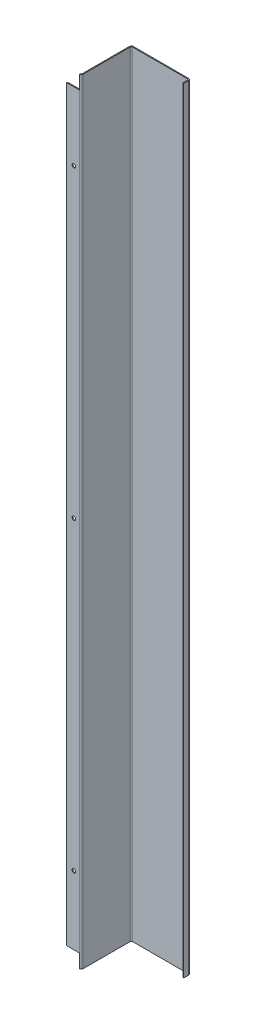
ISO-10303-21;
HEADER;
FILE_DESCRIPTION(('STEP AP214'),'2;1');
FILE_NAME('part.step','',(''),(''),'','','');
FILE_SCHEMA(('AUTOMOTIVE_DESIGN { 1 0 10303 214 1 1 1 1 }'));
ENDSEC;
DATA;
#1=APPLICATION_CONTEXT('core data for automotive mechanical design processes');
#2=APPLICATION_PROTOCOL_DEFINITION('international standard','automotive_design',2000,#1);
#3=PRODUCT_CONTEXT('',#1,'mechanical');
#4=PRODUCT('Part','Part','',(#3));
#5=PRODUCT_RELATED_PRODUCT_CATEGORY('part','',(#4));
#6=PRODUCT_DEFINITION_FORMATION('','',#4);
#7=PRODUCT_DEFINITION_CONTEXT('part definition',#1,'design');
#8=PRODUCT_DEFINITION('design','',#6,#7);
#9=PRODUCT_DEFINITION_SHAPE('','',#8);
#10=(LENGTH_UNIT() NAMED_UNIT(*) SI_UNIT(.MILLI.,.METRE.));
#11=(NAMED_UNIT(*) PLANE_ANGLE_UNIT() SI_UNIT($,.RADIAN.));
#12=(NAMED_UNIT(*) SI_UNIT($,.STERADIAN.) SOLID_ANGLE_UNIT());
#13=UNCERTAINTY_MEASURE_WITH_UNIT(LENGTH_MEASURE(1.E-05),#10,'distance_accuracy_value','');
#14=(GEOMETRIC_REPRESENTATION_CONTEXT(3) GLOBAL_UNCERTAINTY_ASSIGNED_CONTEXT((#13)) GLOBAL_UNIT_ASSIGNED_CONTEXT((#10,
#11,#12)) REPRESENTATION_CONTEXT('',''));
#15=CARTESIAN_POINT('',(0.,0.,0.));
#16=DIRECTION('',(0.,0.,1.));
#17=DIRECTION('',(1.,0.,0.));
#18=AXIS2_PLACEMENT_3D('',#15,#16,#17);
#19=CARTESIAN_POINT('',(-28.3908045977013,-1406.37931034483,108.));
#20=DIRECTION('',(0.,1.,0.));
#21=DIRECTION('',(-1.,0.,0.));
#22=AXIS2_PLACEMENT_3D('',#19,#20,#21);
#23=PLANE('',#22);
#24=DIRECTION('',(1.,0.,0.));
#25=VECTOR('',#24,1.);
#26=CARTESIAN_POINT('',(-28.3908045977014,-1406.37931034483,106.));
#27=LINE('',#26,#25);
#28=CARTESIAN_POINT('',(-28.3908045977014,-1406.37931034483,106.));
#29=VERTEX_POINT('',#28);
#30=CARTESIAN_POINT('',(-26.3908045977013,-1406.37931034483,106.));
#31=VERTEX_POINT('',#30);
#32=EDGE_CURVE('E263',#29,#31,#27,.T.);
#33=ORIENTED_EDGE('',*,*,#32,.F.);
#34=DIRECTION('',(0.,0.,1.));
#35=VECTOR('',#34,1.);
#36=CARTESIAN_POINT('',(-28.3908045977009,-1406.37931034483,-1.0548335315269E-13));
#37=LINE('',#36,#35);
#38=CARTESIAN_POINT('',(-28.3908045977009,-1406.37931034483,2.5000000000001));
#39=VERTEX_POINT('',#38);
#40=EDGE_CURVE('E272',#39,#29,#37,.T.);
#41=ORIENTED_EDGE('',*,*,#40,.F.);
#42=DIRECTION('',(1.,0.,0.));
#43=VECTOR('',#42,1.);
#44=CARTESIAN_POINT('',(-26.3908045977009,-1406.37931034483,2.5000000000001));
#45=LINE('',#44,#43);
#46=CARTESIAN_POINT('',(-26.3908045977011,-1406.37931034483,2.50000000000012));
#47=VERTEX_POINT('',#46);
#48=EDGE_CURVE('E283',#47,#39,#45,.F.);
#49=ORIENTED_EDGE('',*,*,#48,.F.);
#50=DIRECTION('',(0.,0.,-1.));
#51=VECTOR('',#50,1.);
#52=CARTESIAN_POINT('',(-26.3908045977013,-1406.37931034483,108.));
#53=LINE('',#52,#51);
#54=EDGE_CURVE('E277',#47,#31,#53,.F.);
#55=ORIENTED_EDGE('',*,*,#54,.T.);
#56=EDGE_LOOP('',(#33,#41,#49,#55));
#57=FACE_BOUND('',#56,.T.);
#58=ADVANCED_FACE('F78',(#57),#23,.F.);
#59=CARTESIAN_POINT('',(-28.3908045977011,293.620689655173,0.));
#60=DIRECTION('',(0.,-1.,0.));
#61=DIRECTION('',(1.,0.,0.));
#62=AXIS2_PLACEMENT_3D('',#59,#60,#61);
#63=PLANE('',#62);
#64=DIRECTION('',(1.,0.,0.));
#65=VECTOR('',#64,1.);
#66=CARTESIAN_POINT('',(-28.3908045977014,293.620689655173,106.));
#67=LINE('',#66,#65);
#68=CARTESIAN_POINT('',(-28.3908045977014,293.620689655173,106.));
#69=VERTEX_POINT('',#68);
#70=CARTESIAN_POINT('',(-26.3908045977014,293.620689655173,106.));
#71=VERTEX_POINT('',#70);
#72=EDGE_CURVE('E255',#69,#71,#67,.T.);
#73=ORIENTED_EDGE('',*,*,#72,.T.);
#74=DIRECTION('',(0.,0.,1.));
#75=VECTOR('',#74,1.);
#76=CARTESIAN_POINT('',(-26.3908045977011,293.620689655173,0.));
#77=LINE('',#76,#75);
#78=CARTESIAN_POINT('',(-26.3908045977011,293.620689655173,2.49999999999997));
#79=VERTEX_POINT('',#78);
#80=EDGE_CURVE('E275',#71,#79,#77,.F.);
#81=ORIENTED_EDGE('',*,*,#80,.T.);
#82=DIRECTION('',(1.,0.,0.));
#83=VECTOR('',#82,1.);
#84=CARTESIAN_POINT('',(-28.3908045977011,293.620689655173,2.49999999999998));
#85=LINE('',#84,#83);
#86=CARTESIAN_POINT('',(-28.3908045977011,293.620689655173,2.49999999999997));
#87=VERTEX_POINT('',#86);
#88=EDGE_CURVE('E266',#79,#87,#85,.F.);
#89=ORIENTED_EDGE('',*,*,#88,.T.);
#90=DIRECTION('',(0.,0.,-1.));
#91=VECTOR('',#90,1.);
#92=CARTESIAN_POINT('',(-28.3908045977011,293.620689655173,-1.05483353152691E-13));
#93=LINE('',#92,#91);
#94=EDGE_CURVE('E269',#69,#87,#93,.T.);
#95=ORIENTED_EDGE('',*,*,#94,.F.);
#96=EDGE_LOOP('',(#73,#81,#89,#95));
#97=FACE_BOUND('',#96,.T.);
#98=ADVANCED_FACE('F438',(#97),#63,.F.);
#99=CARTESIAN_POINT('',(-28.3908045977011,0.,-1.05483353152691E-13));
#100=DIRECTION('',(1.,0.,0.));
#101=DIRECTION('',(0.,0.,-1.));
#102=AXIS2_PLACEMENT_3D('',#99,#100,#101);
#103=PLANE('',#102);
#104=DIRECTION('',(0.,1.,0.));
#105=VECTOR('',#104,1.);
#106=CARTESIAN_POINT('',(-28.3908045977014,293.620689655173,106.));
#107=LINE('',#106,#105);
#108=EDGE_CURVE('E260',#69,#29,#107,.F.);
#109=ORIENTED_EDGE('',*,*,#108,.F.);
#110=ORIENTED_EDGE('',*,*,#94,.T.);
#111=DIRECTION('',(0.,-1.,0.));
#112=VECTOR('',#111,1.);
#113=CARTESIAN_POINT('',(-28.3908045977011,293.620689655173,2.49999999999998));
#114=LINE('',#113,#112);
#115=EDGE_CURVE('E280',#39,#87,#114,.F.);
#116=ORIENTED_EDGE('',*,*,#115,.F.);
#117=ORIENTED_EDGE('',*,*,#40,.T.);
#118=EDGE_LOOP('',(#109,#110,#116,#117));
#119=FACE_BOUND('',#118,.T.);
#120=ADVANCED_FACE('F428',(#119),#103,.F.);
#121=CARTESIAN_POINT('',(-26.3908045977011,0.,0.));
#122=DIRECTION('',(1.,0.,0.));
#123=DIRECTION('',(0.,0.,-1.));
#124=AXIS2_PLACEMENT_3D('',#121,#122,#123);
#125=PLANE('',#124);
#126=ORIENTED_EDGE('',*,*,#80,.F.);
#127=DIRECTION('',(0.,1.,0.));
#128=VECTOR('',#127,1.);
#129=CARTESIAN_POINT('',(-26.3908045977014,293.620689655173,106.));
#130=LINE('',#129,#128);
#131=EDGE_CURVE('E248',#71,#31,#130,.F.);
#132=ORIENTED_EDGE('',*,*,#131,.T.);
#133=ORIENTED_EDGE('',*,*,#54,.F.);
#134=DIRECTION('',(0.,-1.,0.));
#135=VECTOR('',#134,1.);
#136=CARTESIAN_POINT('',(-26.3908045977011,293.620689655173,2.49999999999999));
#137=LINE('',#136,#135);
#138=EDGE_CURVE('E286',#79,#47,#137,.T.);
#139=ORIENTED_EDGE('',*,*,#138,.F.);
#140=EDGE_LOOP('',(#126,#132,#133,#139));
#141=FACE_BOUND('',#140,.T.);
#142=ADVANCED_FACE('F418',(#141),#125,.T.);
#143=CARTESIAN_POINT('',(0.,0.,-2.));
#144=DIRECTION('',(0.,0.,-1.));
#145=DIRECTION('',(-1.,0.,0.));
#146=AXIS2_PLACEMENT_3D('',#143,#144,#145);
#147=PLANE('',#146);
#148=DIRECTION('',(1.,0.,0.));
#149=VECTOR('',#148,1.);
#150=CARTESIAN_POINT('',(101.609195402299,-1406.37931034483,-2.));
#151=LINE('',#150,#149);
#152=CARTESIAN_POINT('',(-23.8908045977008,-1406.37931034483,-1.99999999999998));
#153=VERTEX_POINT('',#152);
#154=CARTESIAN_POINT('',(97.1091954022989,-1406.37931034483,-2.));
#155=VERTEX_POINT('',#154);
#156=EDGE_CURVE('E370',#153,#155,#151,.T.);
#157=ORIENTED_EDGE('',*,*,#156,.F.);
#158=DIRECTION('',(0.,-1.,0.));
#159=VECTOR('',#158,1.);
#160=CARTESIAN_POINT('',(-23.8908045977008,-1406.37931034483,-1.99999999999998));
#161=LINE('',#160,#159);
#162=CARTESIAN_POINT('',(-23.8908045977009,293.620689655173,-2.));
#163=VERTEX_POINT('',#162);
#164=EDGE_CURVE('E290',#153,#163,#161,.F.);
#165=ORIENTED_EDGE('',*,*,#164,.T.);
#166=DIRECTION('',(-1.,0.,0.));
#167=VECTOR('',#166,1.);
#168=CARTESIAN_POINT('',(101.609195402299,293.620689655173,-2.));
#169=LINE('',#168,#167);
#170=CARTESIAN_POINT('',(97.1091954022988,293.620689655173,-1.99999999999998));
#171=VERTEX_POINT('',#170);
#172=EDGE_CURVE('E367',#171,#163,#169,.T.);
#173=ORIENTED_EDGE('',*,*,#172,.F.);
#174=DIRECTION('',(0.,1.,0.));
#175=VECTOR('',#174,1.);
#176=CARTESIAN_POINT('',(97.1091954022988,293.620689655173,-1.99999999999998));
#177=LINE('',#176,#175);
#178=EDGE_CURVE('E343',#171,#155,#177,.F.);
#179=ORIENTED_EDGE('',*,*,#178,.T.);
#180=EDGE_LOOP('',(#157,#165,#173,#179));
#181=FACE_BOUND('',#180,.T.);
#182=ADVANCED_FACE('F504',(#181),#147,.T.);
#183=CARTESIAN_POINT('',(0.,0.,0.));
#184=DIRECTION('',(0.,0.,-1.));
#185=DIRECTION('',(-1.,0.,0.));
#186=AXIS2_PLACEMENT_3D('',#183,#184,#185);
#187=PLANE('',#186);
#188=DIRECTION('',(0.,-1.,0.));
#189=VECTOR('',#188,1.);
#190=CARTESIAN_POINT('',(-23.8908045977009,-1406.37931034483,0.));
#191=LINE('',#190,#189);
#192=CARTESIAN_POINT('',(-23.8908045977009,-1406.37931034483,0.));
#193=VERTEX_POINT('',#192);
#194=CARTESIAN_POINT('',(-23.8908045977009,293.620689655173,-1.24032728532342E-13));
#195=VERTEX_POINT('',#194);
#196=EDGE_CURVE('E303',#193,#195,#191,.F.);
#197=ORIENTED_EDGE('',*,*,#196,.F.);
#198=DIRECTION('',(1.,0.,0.));
#199=VECTOR('',#198,1.);
#200=CARTESIAN_POINT('',(101.609195402299,-1406.37931034483,0.));
#201=LINE('',#200,#199);
#202=CARTESIAN_POINT('',(97.1091954022989,-1406.37931034483,-1.25333771139324E-13));
#203=VERTEX_POINT('',#202);
#204=EDGE_CURVE('E371',#193,#203,#201,.T.);
#205=ORIENTED_EDGE('',*,*,#204,.T.);
#206=DIRECTION('',(0.,1.,0.));
#207=VECTOR('',#206,1.);
#208=CARTESIAN_POINT('',(97.1091954022989,293.620689655173,0.));
#209=LINE('',#208,#207);
#210=CARTESIAN_POINT('',(97.1091954022989,293.620689655173,0.));
#211=VERTEX_POINT('',#210);
#212=EDGE_CURVE('E356',#211,#203,#209,.F.);
#213=ORIENTED_EDGE('',*,*,#212,.F.);
#214=DIRECTION('',(-1.,0.,0.));
#215=VECTOR('',#214,1.);
#216=CARTESIAN_POINT('',(101.609195402299,293.620689655173,0.));
#217=LINE('',#216,#215);
#218=EDGE_CURVE('E364',#211,#195,#217,.T.);
#219=ORIENTED_EDGE('',*,*,#218,.T.);
#220=EDGE_LOOP('',(#197,#205,#213,#219));
#221=FACE_BOUND('',#220,.T.);
#222=ADVANCED_FACE('F507',(#221),#187,.F.);
#223=CARTESIAN_POINT('',(101.609195402299,-1406.37931034483,-2.));
#224=DIRECTION('',(0.,-1.,0.));
#225=DIRECTION('',(0.,0.,-1.));
#226=AXIS2_PLACEMENT_3D('',#223,#224,#225);
#227=PLANE('',#226);
#228=ORIENTED_EDGE('',*,*,#204,.F.);
#229=DIRECTION('',(0.,0.,-1.));
#230=VECTOR('',#229,1.);
#231=CARTESIAN_POINT('',(-23.8908045977009,-1406.37931034483,0.));
#232=LINE('',#231,#230);
#233=EDGE_CURVE('E297',#193,#153,#232,.T.);
#234=ORIENTED_EDGE('',*,*,#233,.T.);
#235=ORIENTED_EDGE('',*,*,#156,.T.);
#236=DIRECTION('',(0.,0.,-1.));
#237=VECTOR('',#236,1.);
#238=CARTESIAN_POINT('',(97.1091954022989,-1406.37931034483,-1.25333771139324E-13));
#239=LINE('',#238,#237);
#240=EDGE_CURVE('E361',#203,#155,#239,.T.);
#241=ORIENTED_EDGE('',*,*,#240,.F.);
#242=EDGE_LOOP('',(#228,#234,#235,#241));
#243=FACE_BOUND('',#242,.T.);
#244=ADVANCED_FACE('F510',(#243),#227,.T.);
#245=CARTESIAN_POINT('',(101.609195402299,293.620689655173,-2.));
#246=DIRECTION('',(0.,1.,0.));
#247=DIRECTION('',(0.,0.,1.));
#248=AXIS2_PLACEMENT_3D('',#245,#246,#247);
#249=PLANE('',#248);
#250=DIRECTION('',(0.,0.,-1.));
#251=VECTOR('',#250,1.);
#252=CARTESIAN_POINT('',(-23.8908045977009,293.620689655173,-1.24032728532342E-13));
#253=LINE('',#252,#251);
#254=EDGE_CURVE('E307',#195,#163,#253,.T.);
#255=ORIENTED_EDGE('',*,*,#254,.F.);
#256=ORIENTED_EDGE('',*,*,#218,.F.);
#257=DIRECTION('',(0.,0.,-1.));
#258=VECTOR('',#257,1.);
#259=CARTESIAN_POINT('',(97.1091954022989,293.620689655173,0.));
#260=LINE('',#259,#258);
#261=EDGE_CURVE('E350',#211,#171,#260,.T.);
#262=ORIENTED_EDGE('',*,*,#261,.T.);
#263=ORIENTED_EDGE('',*,*,#172,.T.);
#264=EDGE_LOOP('',(#255,#256,#262,#263));
#265=FACE_BOUND('',#264,.T.);
#266=ADVANCED_FACE('F80',(#265),#249,.T.);
#267=CARTESIAN_POINT('',(97.109195402299,-1406.37931034483,2.49999999999997));
#268=DIRECTION('',(0.,-1.,0.));
#269=DIRECTION('',(0.,0.,-1.));
#270=AXIS2_PLACEMENT_3D('',#267,#268,#269);
#271=PLANE('',#270);
#272=DIRECTION('',(-1.,0.,0.));
#273=VECTOR('',#272,1.);
#274=CARTESIAN_POINT('',(101.609195402299,-1406.37931034483,2.49999999999998));
#275=LINE('',#274,#273);
#276=CARTESIAN_POINT('',(99.6091954022991,-1406.37931034483,2.49999999999996));
#277=VERTEX_POINT('',#276);
#278=CARTESIAN_POINT('',(101.609195402299,-1406.37931034483,2.49999999999995));
#279=VERTEX_POINT('',#278);
#280=EDGE_CURVE('E310',#277,#279,#275,.F.);
#281=ORIENTED_EDGE('',*,*,#280,.F.);
#282=CARTESIAN_POINT('',(97.109195402299,-1406.37931034483,2.49999999999997));
#283=DIRECTION('',(0.,1.,0.));
#284=DIRECTION('',(0.,0.,1.));
#285=AXIS2_PLACEMENT_3D('',#282,#283,#284);
#286=CIRCLE('',#285,2.5000000000001);
#287=EDGE_CURVE('E353',#203,#277,#286,.F.);
#288=ORIENTED_EDGE('',*,*,#287,.F.);
#289=ORIENTED_EDGE('',*,*,#240,.T.);
#290=CARTESIAN_POINT('',(97.109195402299,-1406.37931034483,2.49999999999997));
#291=DIRECTION('',(0.,1.,0.));
#292=DIRECTION('',(0.,0.,1.));
#293=AXIS2_PLACEMENT_3D('',#290,#291,#292);
#294=CIRCLE('',#293,4.5000000000001);
#295=EDGE_CURVE('E346',#155,#279,#294,.F.);
#296=ORIENTED_EDGE('',*,*,#295,.T.);
#297=EDGE_LOOP('',(#281,#288,#289,#296));
#298=FACE_BOUND('',#297,.T.);
#299=ADVANCED_FACE('F497',(#298),#271,.T.);
#300=CARTESIAN_POINT('',(97.109195402299,293.620689655173,2.50000000000012));
#301=DIRECTION('',(0.,-1.,0.));
#302=DIRECTION('',(0.,0.,-1.));
#303=AXIS2_PLACEMENT_3D('',#300,#301,#302);
#304=PLANE('',#303);
#305=CARTESIAN_POINT('',(97.109195402299,293.620689655173,2.50000000000012));
#306=DIRECTION('',(0.,1.,0.));
#307=DIRECTION('',(0.,0.,1.));
#308=AXIS2_PLACEMENT_3D('',#305,#306,#307);
#309=CIRCLE('',#308,2.5000000000001);
#310=CARTESIAN_POINT('',(99.6091954022991,293.620689655173,2.50000000000011));
#311=VERTEX_POINT('',#310);
#312=EDGE_CURVE('E316',#311,#211,#309,.T.);
#313=ORIENTED_EDGE('',*,*,#312,.F.);
#314=DIRECTION('',(-1.,0.,0.));
#315=VECTOR('',#314,1.);
#316=CARTESIAN_POINT('',(99.6091954022989,293.620689655173,2.50000000000009));
#317=LINE('',#316,#315);
#318=CARTESIAN_POINT('',(101.609195402299,293.620689655173,2.50000000000008));
#319=VERTEX_POINT('',#318);
#320=EDGE_CURVE('E336',#311,#319,#317,.F.);
#321=ORIENTED_EDGE('',*,*,#320,.T.);
#322=CARTESIAN_POINT('',(97.109195402299,293.620689655173,2.50000000000012));
#323=DIRECTION('',(0.,1.,0.));
#324=DIRECTION('',(0.,0.,1.));
#325=AXIS2_PLACEMENT_3D('',#322,#323,#324);
#326=CIRCLE('',#325,4.5000000000001);
#327=EDGE_CURVE('E347',#319,#171,#326,.T.);
#328=ORIENTED_EDGE('',*,*,#327,.T.);
#329=ORIENTED_EDGE('',*,*,#261,.F.);
#330=EDGE_LOOP('',(#313,#321,#328,#329));
#331=FACE_BOUND('',#330,.T.);
#332=ADVANCED_FACE('F492',(#331),#304,.F.);
#333=CARTESIAN_POINT('',(97.109195402299,293.620689655173,2.50000000000012));
#334=DIRECTION('',(0.,1.,0.));
#335=DIRECTION('',(1.,0.,0.));
#336=AXIS2_PLACEMENT_3D('',#333,#334,#335);
#337=CYLINDRICAL_SURFACE('',#336,4.5000000000001);
#338=ORIENTED_EDGE('',*,*,#178,.F.);
#339=ORIENTED_EDGE('',*,*,#327,.F.);
#340=DIRECTION('',(0.,1.,0.));
#341=VECTOR('',#340,1.);
#342=CARTESIAN_POINT('',(101.609195402299,-1406.37931034483,2.49999999999998));
#343=LINE('',#342,#341);
#344=EDGE_CURVE('E334',#319,#279,#343,.F.);
#345=ORIENTED_EDGE('',*,*,#344,.T.);
#346=ORIENTED_EDGE('',*,*,#295,.F.);
#347=EDGE_LOOP('',(#338,#339,#345,#346));
#348=FACE_BOUND('',#347,.T.);
#349=ADVANCED_FACE('F489',(#348),#337,.T.);
#350=CARTESIAN_POINT('',(97.109195402299,293.620689655173,2.50000000000012));
#351=DIRECTION('',(0.,1.,0.));
#352=DIRECTION('',(1.,0.,0.));
#353=AXIS2_PLACEMENT_3D('',#350,#351,#352);
#354=CYLINDRICAL_SURFACE('',#353,2.5000000000001);
#355=ORIENTED_EDGE('',*,*,#212,.T.);
#356=ORIENTED_EDGE('',*,*,#287,.T.);
#357=DIRECTION('',(0.,1.,0.));
#358=VECTOR('',#357,1.);
#359=CARTESIAN_POINT('',(99.6091954022991,-1406.37931034483,2.49999999999999));
#360=LINE('',#359,#358);
#361=EDGE_CURVE('E339',#277,#311,#360,.T.);
#362=ORIENTED_EDGE('',*,*,#361,.T.);
#363=ORIENTED_EDGE('',*,*,#312,.T.);
#364=EDGE_LOOP('',(#355,#356,#362,#363));
#365=FACE_BOUND('',#364,.T.);
#366=ADVANCED_FACE('F487',(#365),#354,.F.);
#367=CARTESIAN_POINT('',(101.609195402299,293.620689655173,13.));
#368=DIRECTION('',(0.,-1.,0.));
#369=DIRECTION('',(1.,0.,0.));
#370=AXIS2_PLACEMENT_3D('',#367,#368,#369);
#371=PLANE('',#370);
#372=ORIENTED_EDGE('',*,*,#320,.F.);
#373=DIRECTION('',(0.,0.,-1.));
#374=VECTOR('',#373,1.);
#375=CARTESIAN_POINT('',(99.6091954022989,293.620689655173,13.));
#376=LINE('',#375,#374);
#377=CARTESIAN_POINT('',(99.6091954022989,293.620689655173,13.));
#378=VERTEX_POINT('',#377);
#379=EDGE_CURVE('E332',#311,#378,#376,.F.);
#380=ORIENTED_EDGE('',*,*,#379,.T.);
#381=DIRECTION('',(-1.,0.,0.));
#382=VECTOR('',#381,1.);
#383=CARTESIAN_POINT('',(101.609195402299,293.620689655173,13.));
#384=LINE('',#383,#382);
#385=CARTESIAN_POINT('',(101.609195402299,293.620689655173,13.));
#386=VERTEX_POINT('',#385);
#387=EDGE_CURVE('E313',#386,#378,#384,.T.);
#388=ORIENTED_EDGE('',*,*,#387,.F.);
#389=DIRECTION('',(0.,0.,1.));
#390=VECTOR('',#389,1.);
#391=CARTESIAN_POINT('',(101.609195402299,293.620689655173,-4.40863225174874E-13));
#392=LINE('',#391,#390);
#393=EDGE_CURVE('E325',#319,#386,#392,.T.);
#394=ORIENTED_EDGE('',*,*,#393,.F.);
#395=EDGE_LOOP('',(#372,#380,#388,#394));
#396=FACE_BOUND('',#395,.T.);
#397=ADVANCED_FACE('F480',(#396),#371,.F.);
#398=CARTESIAN_POINT('',(101.609195402299,-1406.37931034483,0.));
#399=DIRECTION('',(0.,1.,0.));
#400=DIRECTION('',(-1.,0.,0.));
#401=AXIS2_PLACEMENT_3D('',#398,#399,#400);
#402=PLANE('',#401);
#403=ORIENTED_EDGE('',*,*,#280,.T.);
#404=DIRECTION('',(0.,0.,-1.));
#405=VECTOR('',#404,1.);
#406=CARTESIAN_POINT('',(101.609195402299,-1406.37931034483,-4.40863225174875E-13));
#407=LINE('',#406,#405);
#408=CARTESIAN_POINT('',(101.609195402299,-1406.37931034483,13.));
#409=VERTEX_POINT('',#408);
#410=EDGE_CURVE('E320',#409,#279,#407,.T.);
#411=ORIENTED_EDGE('',*,*,#410,.F.);
#412=DIRECTION('',(-1.,0.,0.));
#413=VECTOR('',#412,1.);
#414=CARTESIAN_POINT('',(101.609195402299,-1406.37931034483,13.));
#415=LINE('',#414,#413);
#416=CARTESIAN_POINT('',(99.6091954022992,-1406.37931034483,13.));
#417=VERTEX_POINT('',#416);
#418=EDGE_CURVE('E317',#409,#417,#415,.T.);
#419=ORIENTED_EDGE('',*,*,#418,.T.);
#420=DIRECTION('',(0.,0.,1.));
#421=VECTOR('',#420,1.);
#422=CARTESIAN_POINT('',(99.6091954022991,-1406.37931034483,0.));
#423=LINE('',#422,#421);
#424=EDGE_CURVE('E327',#417,#277,#423,.F.);
#425=ORIENTED_EDGE('',*,*,#424,.T.);
#426=EDGE_LOOP('',(#403,#411,#419,#425));
#427=FACE_BOUND('',#426,.T.);
#428=ADVANCED_FACE('F473',(#427),#402,.F.);
#429=CARTESIAN_POINT('',(101.609195402299,0.,-4.40863225174874E-13));
#430=DIRECTION('',(-1.,0.,0.));
#431=DIRECTION('',(0.,0.,1.));
#432=AXIS2_PLACEMENT_3D('',#429,#430,#431);
#433=PLANE('',#432);
#434=ORIENTED_EDGE('',*,*,#344,.F.);
#435=ORIENTED_EDGE('',*,*,#393,.T.);
#436=DIRECTION('',(0.,-1.,0.));
#437=VECTOR('',#436,1.);
#438=CARTESIAN_POINT('',(101.609195402299,0.,13.));
#439=LINE('',#438,#437);
#440=EDGE_CURVE('E323',#386,#409,#439,.T.);
#441=ORIENTED_EDGE('',*,*,#440,.T.);
#442=ORIENTED_EDGE('',*,*,#410,.T.);
#443=EDGE_LOOP('',(#434,#435,#441,#442));
#444=FACE_BOUND('',#443,.T.);
#445=ADVANCED_FACE('F469',(#444),#433,.F.);
#446=CARTESIAN_POINT('',(99.6091954022989,0.,-4.33880262497188E-13));
#447=DIRECTION('',(-1.,0.,0.));
#448=DIRECTION('',(0.,0.,1.));
#449=AXIS2_PLACEMENT_3D('',#446,#447,#448);
#450=PLANE('',#449);
#451=ORIENTED_EDGE('',*,*,#379,.F.);
#452=ORIENTED_EDGE('',*,*,#361,.F.);
#453=ORIENTED_EDGE('',*,*,#424,.F.);
#454=DIRECTION('',(0.,1.,0.));
#455=VECTOR('',#454,1.);
#456=CARTESIAN_POINT('',(99.6091954022992,-1406.37931034483,13.));
#457=LINE('',#456,#455);
#458=EDGE_CURVE('E330',#378,#417,#457,.F.);
#459=ORIENTED_EDGE('',*,*,#458,.F.);
#460=EDGE_LOOP('',(#451,#452,#453,#459));
#461=FACE_BOUND('',#460,.T.);
#462=ADVANCED_FACE('F472',(#461),#450,.T.);
#463=CARTESIAN_POINT('',(101.609195402299,-1406.37931034483,13.));
#464=DIRECTION('',(0.,0.,-1.));
#465=DIRECTION('',(-1.,0.,0.));
#466=AXIS2_PLACEMENT_3D('',#463,#464,#465);
#467=PLANE('',#466);
#468=ORIENTED_EDGE('',*,*,#458,.T.);
#469=ORIENTED_EDGE('',*,*,#418,.F.);
#470=ORIENTED_EDGE('',*,*,#440,.F.);
#471=ORIENTED_EDGE('',*,*,#387,.T.);
#472=EDGE_LOOP('',(#468,#469,#470,#471));
#473=FACE_BOUND('',#472,.T.);
#474=ADVANCED_FACE('F466',(#473),#467,.F.);
#475=CARTESIAN_POINT('',(-23.890804597701,293.620689655173,2.49999999999998));
#476=DIRECTION('',(0.,1.,0.));
#477=DIRECTION('',(0.,0.,1.));
#478=AXIS2_PLACEMENT_3D('',#475,#476,#477);
#479=PLANE('',#478);
#480=ORIENTED_EDGE('',*,*,#88,.F.);
#481=CARTESIAN_POINT('',(-23.890804597701,293.620689655173,2.49999999999998));
#482=DIRECTION('',(0.,-1.,0.));
#483=DIRECTION('',(0.,0.,-1.));
#484=AXIS2_PLACEMENT_3D('',#481,#482,#483);
#485=CIRCLE('',#484,2.50000000000011);
#486=EDGE_CURVE('E300',#195,#79,#485,.F.);
#487=ORIENTED_EDGE('',*,*,#486,.F.);
#488=ORIENTED_EDGE('',*,*,#254,.T.);
#489=CARTESIAN_POINT('',(-23.890804597701,293.620689655173,2.49999999999998));
#490=DIRECTION('',(0.,-1.,0.));
#491=DIRECTION('',(0.,0.,-1.));
#492=AXIS2_PLACEMENT_3D('',#489,#490,#491);
#493=CIRCLE('',#492,4.50000000000011);
#494=EDGE_CURVE('E293',#163,#87,#493,.F.);
#495=ORIENTED_EDGE('',*,*,#494,.T.);
#496=EDGE_LOOP('',(#480,#487,#488,#495));
#497=FACE_BOUND('',#496,.T.);
#498=ADVANCED_FACE('F434',(#497),#479,.T.);
#499=CARTESIAN_POINT('',(-23.890804597701,-1406.37931034483,2.50000000000013));
#500=DIRECTION('',(0.,1.,0.));
#501=DIRECTION('',(0.,0.,1.));
#502=AXIS2_PLACEMENT_3D('',#499,#500,#501);
#503=PLANE('',#502);
#504=CARTESIAN_POINT('',(-23.890804597701,-1406.37931034483,2.50000000000013));
#505=DIRECTION('',(0.,-1.,0.));
#506=DIRECTION('',(0.,0.,-1.));
#507=AXIS2_PLACEMENT_3D('',#504,#505,#506);
#508=CIRCLE('',#507,2.50000000000011);
#509=EDGE_CURVE('E271',#47,#193,#508,.T.);
#510=ORIENTED_EDGE('',*,*,#509,.F.);
#511=ORIENTED_EDGE('',*,*,#48,.T.);
#512=CARTESIAN_POINT('',(-23.890804597701,-1406.37931034483,2.50000000000013));
#513=DIRECTION('',(0.,-1.,0.));
#514=DIRECTION('',(0.,0.,-1.));
#515=AXIS2_PLACEMENT_3D('',#512,#513,#514);
#516=CIRCLE('',#515,4.50000000000011);
#517=EDGE_CURVE('E294',#39,#153,#516,.T.);
#518=ORIENTED_EDGE('',*,*,#517,.T.);
#519=ORIENTED_EDGE('',*,*,#233,.F.);
#520=EDGE_LOOP('',(#510,#511,#518,#519));
#521=FACE_BOUND('',#520,.T.);
#522=ADVANCED_FACE('F425',(#521),#503,.F.);
#523=CARTESIAN_POINT('',(-23.890804597701,-1406.37931034483,2.50000000000013));
#524=DIRECTION('',(0.,-1.,0.));
#525=DIRECTION('',(-1.,0.,0.));
#526=AXIS2_PLACEMENT_3D('',#523,#524,#525);
#527=CYLINDRICAL_SURFACE('',#526,4.50000000000011);
#528=ORIENTED_EDGE('',*,*,#164,.F.);
#529=ORIENTED_EDGE('',*,*,#517,.F.);
#530=ORIENTED_EDGE('',*,*,#115,.T.);
#531=ORIENTED_EDGE('',*,*,#494,.F.);
#532=EDGE_LOOP('',(#528,#529,#530,#531));
#533=FACE_BOUND('',#532,.T.);
#534=ADVANCED_FACE('F431',(#533),#527,.T.);
#535=CARTESIAN_POINT('',(-23.890804597701,-1406.37931034483,2.50000000000013));
#536=DIRECTION('',(0.,-1.,0.));
#537=DIRECTION('',(-1.,0.,0.));
#538=AXIS2_PLACEMENT_3D('',#535,#536,#537);
#539=CYLINDRICAL_SURFACE('',#538,2.50000000000011);
#540=ORIENTED_EDGE('',*,*,#196,.T.);
#541=ORIENTED_EDGE('',*,*,#486,.T.);
#542=ORIENTED_EDGE('',*,*,#138,.T.);
#543=ORIENTED_EDGE('',*,*,#509,.T.);
#544=EDGE_LOOP('',(#540,#541,#542,#543));
#545=FACE_BOUND('',#544,.T.);
#546=ADVANCED_FACE('F448',(#545),#539,.F.);
#547=CARTESIAN_POINT('',(-30.3908045977014,-1406.37931034483,106.));
#548=DIRECTION('',(0.,-1.,0.));
#549=DIRECTION('',(0.,0.,-1.));
#550=AXIS2_PLACEMENT_3D('',#547,#548,#549);
#551=PLANE('',#550);
#552=DIRECTION('',(0.,0.,1.));
#553=VECTOR('',#552,1.);
#554=CARTESIAN_POINT('',(-30.3908045977013,-1406.37931034483,108.));
#555=LINE('',#554,#553);
#556=CARTESIAN_POINT('',(-30.3908045977014,-1406.37931034483,108.));
#557=VERTEX_POINT('',#556);
#558=CARTESIAN_POINT('',(-30.3908045977014,-1406.37931034483,110.));
#559=VERTEX_POINT('',#558);
#560=EDGE_CURVE('E218',#557,#559,#555,.T.);
#561=ORIENTED_EDGE('',*,*,#560,.F.);
#562=CARTESIAN_POINT('',(-30.3908045977014,-1406.37931034483,106.));
#563=DIRECTION('',(0.,1.,0.));
#564=DIRECTION('',(0.,0.,1.));
#565=AXIS2_PLACEMENT_3D('',#562,#563,#564);
#566=CIRCLE('',#565,1.99999999999999);
#567=EDGE_CURVE('E258',#29,#557,#566,.F.);
#568=ORIENTED_EDGE('',*,*,#567,.F.);
#569=ORIENTED_EDGE('',*,*,#32,.T.);
#570=CARTESIAN_POINT('',(-30.3908045977014,-1406.37931034483,106.));
#571=DIRECTION('',(0.,1.,0.));
#572=DIRECTION('',(0.,0.,1.));
#573=AXIS2_PLACEMENT_3D('',#570,#571,#572);
#574=CIRCLE('',#573,3.99999999999999);
#575=EDGE_CURVE('E251',#31,#559,#574,.F.);
#576=ORIENTED_EDGE('',*,*,#575,.T.);
#577=EDGE_LOOP('',(#561,#568,#569,#576));
#578=FACE_BOUND('',#577,.T.);
#579=ADVANCED_FACE('F410',(#578),#551,.T.);
#580=CARTESIAN_POINT('',(-30.3908045977014,293.620689655173,106.));
#581=DIRECTION('',(0.,-1.,0.));
#582=DIRECTION('',(0.,0.,-1.));
#583=AXIS2_PLACEMENT_3D('',#580,#581,#582);
#584=PLANE('',#583);
#585=CARTESIAN_POINT('',(-30.3908045977014,293.620689655173,106.));
#586=DIRECTION('',(0.,1.,0.));
#587=DIRECTION('',(0.,0.,1.));
#588=AXIS2_PLACEMENT_3D('',#585,#586,#587);
#589=CIRCLE('',#588,1.99999999999999);
#590=CARTESIAN_POINT('',(-30.3908045977014,293.620689655173,108.));
#591=VERTEX_POINT('',#590);
#592=EDGE_CURVE('E246',#591,#69,#589,.T.);
#593=ORIENTED_EDGE('',*,*,#592,.F.);
#594=DIRECTION('',(0.,0.,1.));
#595=VECTOR('',#594,1.);
#596=CARTESIAN_POINT('',(-30.3908045977015,293.620689655173,108.));
#597=LINE('',#596,#595);
#598=CARTESIAN_POINT('',(-30.3908045977014,293.620689655173,110.));
#599=VERTEX_POINT('',#598);
#600=EDGE_CURVE('E212',#591,#599,#597,.T.);
#601=ORIENTED_EDGE('',*,*,#600,.T.);
#602=CARTESIAN_POINT('',(-30.3908045977014,293.620689655173,106.));
#603=DIRECTION('',(0.,1.,0.));
#604=DIRECTION('',(0.,0.,1.));
#605=AXIS2_PLACEMENT_3D('',#602,#603,#604);
#606=CIRCLE('',#605,3.99999999999999);
#607=EDGE_CURVE('E252',#599,#71,#606,.T.);
#608=ORIENTED_EDGE('',*,*,#607,.T.);
#609=ORIENTED_EDGE('',*,*,#72,.F.);
#610=EDGE_LOOP('',(#593,#601,#608,#609));
#611=FACE_BOUND('',#610,.T.);
#612=ADVANCED_FACE('F440',(#611),#584,.F.);
#613=CARTESIAN_POINT('',(-30.3908045977014,293.620689655173,106.));
#614=DIRECTION('',(0.,1.,0.));
#615=DIRECTION('',(0.,0.,1.));
#616=AXIS2_PLACEMENT_3D('',#613,#614,#615);
#617=CYLINDRICAL_SURFACE('',#616,3.99999999999999);
#618=ORIENTED_EDGE('',*,*,#131,.F.);
#619=ORIENTED_EDGE('',*,*,#607,.F.);
#620=DIRECTION('',(0.,-1.,0.));
#621=VECTOR('',#620,1.);
#622=CARTESIAN_POINT('',(-30.3908045977015,0.,110.));
#623=LINE('',#622,#621);
#624=CARTESIAN_POINT('',(-30.3908045977014,263.620689655173,110.));
#625=VERTEX_POINT('',#624);
#626=EDGE_CURVE('E242',#599,#625,#623,.T.);
#627=ORIENTED_EDGE('',*,*,#626,.T.);
#628=CARTESIAN_POINT('',(-30.3908045977014,-1376.37931034483,110.));
#629=VERTEX_POINT('',#628);
#630=EDGE_CURVE('E240',#625,#629,#623,.T.);
#631=ORIENTED_EDGE('',*,*,#630,.T.);
#632=DIRECTION('',(0.,-1.,0.));
#633=VECTOR('',#632,1.);
#634=CARTESIAN_POINT('',(-30.3908045977014,0.,110.));
#635=LINE('',#634,#633);
#636=EDGE_CURVE('E237',#629,#559,#635,.T.);
#637=ORIENTED_EDGE('',*,*,#636,.T.);
#638=ORIENTED_EDGE('',*,*,#575,.F.);
#639=EDGE_LOOP('',(#618,#619,#627,#631,#637,#638));
#640=FACE_BOUND('',#639,.T.);
#641=ADVANCED_FACE('F405',(#640),#617,.T.);
#642=CARTESIAN_POINT('',(-30.3908045977014,293.620689655173,106.));
#643=DIRECTION('',(0.,1.,0.));
#644=DIRECTION('',(0.,0.,1.));
#645=AXIS2_PLACEMENT_3D('',#642,#643,#644);
#646=CYLINDRICAL_SURFACE('',#645,1.99999999999999);
#647=ORIENTED_EDGE('',*,*,#108,.T.);
#648=ORIENTED_EDGE('',*,*,#567,.T.);
#649=DIRECTION('',(0.,1.,0.));
#650=VECTOR('',#649,1.);
#651=CARTESIAN_POINT('',(-30.3908045977013,-1406.37931034483,108.));
#652=LINE('',#651,#650);
#653=CARTESIAN_POINT('',(-30.3908045977014,-1376.37931034483,108.));
#654=VERTEX_POINT('',#653);
#655=EDGE_CURVE('E220',#557,#654,#652,.T.);
#656=ORIENTED_EDGE('',*,*,#655,.T.);
#657=CARTESIAN_POINT('',(-30.3908045977014,263.620689655173,108.));
#658=VERTEX_POINT('',#657);
#659=EDGE_CURVE('E217',#654,#658,#652,.T.);
#660=ORIENTED_EDGE('',*,*,#659,.T.);
#661=EDGE_CURVE('E207',#658,#591,#652,.T.);
#662=ORIENTED_EDGE('',*,*,#661,.T.);
#663=ORIENTED_EDGE('',*,*,#592,.T.);
#664=EDGE_LOOP('',(#647,#648,#656,#660,#662,#663));
#665=FACE_BOUND('',#664,.T.);
#666=ADVANCED_FACE('F233',(#665),#646,.F.);
#667=CARTESIAN_POINT('',(0.,0.,110.));
#668=DIRECTION('',(0.,0.,-1.));
#669=DIRECTION('',(-1.,0.,0.));
#670=AXIS2_PLACEMENT_3D('',#667,#668,#669);
#671=PLANE('',#670);
#672=CARTESIAN_POINT('',(-42.3908411663428,-556.379310344828,110.));
#673=DIRECTION('',(0.,0.,1.));
#674=DIRECTION('',(1.,0.,0.));
#675=AXIS2_PLACEMENT_3D('',#672,#673,#674);
#676=CIRCLE('',#675,3.99999999999999);
#677=CARTESIAN_POINT('',(-38.3908411663428,-556.379310344828,110.));
#678=VERTEX_POINT('',#677);
#679=EDGE_CURVE('E382',#678,#678,#676,.T.);
#680=ORIENTED_EDGE('',*,*,#679,.F.);
#681=EDGE_LOOP('',(#680));
#682=FACE_BOUND('',#681,.T.);
#683=CARTESIAN_POINT('',(-42.3908777349842,113.620689655173,110.));
#684=DIRECTION('',(0.,0.,1.));
#685=DIRECTION('',(1.,0.,0.));
#686=AXIS2_PLACEMENT_3D('',#683,#684,#685);
#687=CIRCLE('',#686,3.99999999999999);
#688=CARTESIAN_POINT('',(-38.3908777349842,113.620689655173,110.));
#689=VERTEX_POINT('',#688);
#690=EDGE_CURVE('E387',#689,#689,#687,.T.);
#691=ORIENTED_EDGE('',*,*,#690,.F.);
#692=EDGE_LOOP('',(#691));
#693=FACE_BOUND('',#692,.T.);
#694=CARTESIAN_POINT('',(-42.3908045977015,-1226.37931034483,110.));
#695=DIRECTION('',(0.,0.,1.));
#696=DIRECTION('',(1.,0.,0.));
#697=AXIS2_PLACEMENT_3D('',#694,#695,#696);
#698=CIRCLE('',#697,4.00000000000001);
#699=CARTESIAN_POINT('',(-38.3908045977015,-1226.37931034483,110.));
#700=VERTEX_POINT('',#699);
#701=EDGE_CURVE('E379',#700,#700,#698,.T.);
#702=ORIENTED_EDGE('',*,*,#701,.F.);
#703=EDGE_LOOP('',(#702));
#704=FACE_BOUND('',#703,.T.);
#705=ORIENTED_EDGE('',*,*,#630,.F.);
#706=DIRECTION('',(-1.,0.,0.));
#707=VECTOR('',#706,1.);
#708=CARTESIAN_POINT('',(0.,263.620689655173,110.));
#709=LINE('',#708,#707);
#710=CARTESIAN_POINT('',(-58.3908045977015,263.620689655173,110.));
#711=VERTEX_POINT('',#710);
#712=EDGE_CURVE('E222',#625,#711,#709,.T.);
#713=ORIENTED_EDGE('',*,*,#712,.T.);
#714=DIRECTION('',(0.,-1.,0.));
#715=VECTOR('',#714,1.);
#716=CARTESIAN_POINT('',(-58.3908045977013,-1406.37931034483,110.));
#717=LINE('',#716,#715);
#718=CARTESIAN_POINT('',(-58.3908045977013,-1376.37931034483,110.));
#719=VERTEX_POINT('',#718);
#720=EDGE_CURVE('E102',#711,#719,#717,.T.);
#721=ORIENTED_EDGE('',*,*,#720,.T.);
#722=DIRECTION('',(1.,0.,0.));
#723=VECTOR('',#722,1.);
#724=CARTESIAN_POINT('',(0.,-1376.37931034483,110.));
#725=LINE('',#724,#723);
#726=EDGE_CURVE('E401',#719,#629,#725,.T.);
#727=ORIENTED_EDGE('',*,*,#726,.T.);
#728=EDGE_LOOP('',(#705,#713,#721,#727));
#729=FACE_BOUND('',#728,.T.);
#730=ADVANCED_FACE('F626',(#682,#693,#704,#729),#671,.F.);
#731=CARTESIAN_POINT('',(0.,0.,108.));
#732=DIRECTION('',(0.,0.,-1.));
#733=DIRECTION('',(-1.,0.,0.));
#734=AXIS2_PLACEMENT_3D('',#731,#732,#733);
#735=PLANE('',#734);
#736=CARTESIAN_POINT('',(-42.3908411663428,-556.379310344828,108.));
#737=DIRECTION('',(0.,0.,-1.));
#738=DIRECTION('',(-1.,0.,0.));
#739=AXIS2_PLACEMENT_3D('',#736,#737,#738);
#740=CIRCLE('',#739,3.99999999999999);
#741=CARTESIAN_POINT('',(-46.3908411663428,-556.379310344828,108.));
#742=VERTEX_POINT('',#741);
#743=EDGE_CURVE('E82',#742,#742,#740,.T.);
#744=ORIENTED_EDGE('',*,*,#743,.F.);
#745=EDGE_LOOP('',(#744));
#746=FACE_BOUND('',#745,.T.);
#747=CARTESIAN_POINT('',(-42.3908777349842,113.620689655173,108.));
#748=DIRECTION('',(0.,0.,-1.));
#749=DIRECTION('',(-1.,0.,0.));
#750=AXIS2_PLACEMENT_3D('',#747,#748,#749);
#751=CIRCLE('',#750,3.99999999999999);
#752=CARTESIAN_POINT('',(-46.3908777349842,113.620689655173,108.));
#753=VERTEX_POINT('',#752);
#754=EDGE_CURVE('E380',#753,#753,#751,.T.);
#755=ORIENTED_EDGE('',*,*,#754,.F.);
#756=EDGE_LOOP('',(#755));
#757=FACE_BOUND('',#756,.T.);
#758=CARTESIAN_POINT('',(-42.3908045977015,-1226.37931034483,108.));
#759=DIRECTION('',(0.,0.,-1.));
#760=DIRECTION('',(-1.,0.,0.));
#761=AXIS2_PLACEMENT_3D('',#758,#759,#760);
#762=CIRCLE('',#761,4.00000000000001);
#763=CARTESIAN_POINT('',(-46.3908045977015,-1226.37931034483,108.));
#764=VERTEX_POINT('',#763);
#765=EDGE_CURVE('E223',#764,#764,#762,.T.);
#766=ORIENTED_EDGE('',*,*,#765,.F.);
#767=EDGE_LOOP('',(#766));
#768=FACE_BOUND('',#767,.T.);
#769=DIRECTION('',(-1.,0.,0.));
#770=VECTOR('',#769,1.);
#771=CARTESIAN_POINT('',(0.,263.620689655173,108.));
#772=LINE('',#771,#770);
#773=CARTESIAN_POINT('',(-58.3908045977015,263.620689655173,108.));
#774=VERTEX_POINT('',#773);
#775=EDGE_CURVE('E95',#658,#774,#772,.T.);
#776=ORIENTED_EDGE('',*,*,#775,.F.);
#777=ORIENTED_EDGE('',*,*,#659,.F.);
#778=DIRECTION('',(1.,0.,0.));
#779=VECTOR('',#778,1.);
#780=CARTESIAN_POINT('',(0.,-1376.37931034483,108.));
#781=LINE('',#780,#779);
#782=CARTESIAN_POINT('',(-58.3908045977013,-1376.37931034483,108.));
#783=VERTEX_POINT('',#782);
#784=EDGE_CURVE('E400',#783,#654,#781,.T.);
#785=ORIENTED_EDGE('',*,*,#784,.F.);
#786=DIRECTION('',(0.,-1.,0.));
#787=VECTOR('',#786,1.);
#788=CARTESIAN_POINT('',(-58.3908045977013,-1406.37931034483,108.));
#789=LINE('',#788,#787);
#790=EDGE_CURVE('E231',#774,#783,#789,.T.);
#791=ORIENTED_EDGE('',*,*,#790,.F.);
#792=EDGE_LOOP('',(#776,#777,#785,#791));
#793=FACE_BOUND('',#792,.T.);
#794=ADVANCED_FACE('F228',(#746,#757,#768,#793),#735,.T.);
#795=CARTESIAN_POINT('',(-58.3908045977013,-1406.37931034483,110.));
#796=DIRECTION('',(1.,0.,0.));
#797=DIRECTION('',(0.,1.,0.));
#798=AXIS2_PLACEMENT_3D('',#795,#796,#797);
#799=PLANE('',#798);
#800=ORIENTED_EDGE('',*,*,#720,.F.);
#801=DIRECTION('',(0.,0.,-1.));
#802=VECTOR('',#801,1.);
#803=CARTESIAN_POINT('',(-58.3908045977015,263.620689655173,110.));
#804=LINE('',#803,#802);
#805=EDGE_CURVE('E13',#711,#774,#804,.T.);
#806=ORIENTED_EDGE('',*,*,#805,.T.);
#807=ORIENTED_EDGE('',*,*,#790,.T.);
#808=DIRECTION('',(0.,0.,1.));
#809=VECTOR('',#808,1.);
#810=CARTESIAN_POINT('',(-58.3908045977013,-1376.37931034483,110.));
#811=LINE('',#810,#809);
#812=EDGE_CURVE('E87',#783,#719,#811,.T.);
#813=ORIENTED_EDGE('',*,*,#812,.T.);
#814=EDGE_LOOP('',(#800,#806,#807,#813));
#815=FACE_BOUND('',#814,.T.);
#816=ADVANCED_FACE('F634',(#815),#799,.F.);
#817=CARTESIAN_POINT('',(-30.3908045977014,-1406.37931034483,-2.00000000000013));
#818=DIRECTION('',(1.,0.,0.));
#819=DIRECTION('',(0.,0.,-1.));
#820=AXIS2_PLACEMENT_3D('',#817,#818,#819);
#821=PLANE('',#820);
#822=DIRECTION('',(0.,0.,1.));
#823=VECTOR('',#822,1.);
#824=CARTESIAN_POINT('',(-30.3908045977014,-1376.37931034483,-2.00000000000013));
#825=LINE('',#824,#823);
#826=EDGE_CURVE('E397',#654,#629,#825,.T.);
#827=ORIENTED_EDGE('',*,*,#826,.F.);
#828=ORIENTED_EDGE('',*,*,#655,.F.);
#829=ORIENTED_EDGE('',*,*,#560,.T.);
#830=ORIENTED_EDGE('',*,*,#636,.F.);
#831=EDGE_LOOP('',(#827,#828,#829,#830));
#832=FACE_BOUND('',#831,.T.);
#833=ADVANCED_FACE('F639',(#832),#821,.F.);
#834=CARTESIAN_POINT('',(-58.3908045977013,-1376.37931034483,-2.00000000000013));
#835=DIRECTION('',(0.,1.,0.));
#836=DIRECTION('',(0.,0.,1.));
#837=AXIS2_PLACEMENT_3D('',#834,#835,#836);
#838=PLANE('',#837);
#839=ORIENTED_EDGE('',*,*,#812,.F.);
#840=ORIENTED_EDGE('',*,*,#784,.T.);
#841=ORIENTED_EDGE('',*,*,#826,.T.);
#842=ORIENTED_EDGE('',*,*,#726,.F.);
#843=EDGE_LOOP('',(#839,#840,#841,#842));
#844=FACE_BOUND('',#843,.T.);
#845=ADVANCED_FACE('F652',(#844),#838,.F.);
#846=CARTESIAN_POINT('',(-30.3908045977014,293.620689655173,-2.00000000000013));
#847=DIRECTION('',(1.,0.,0.));
#848=DIRECTION('',(0.,0.,-1.));
#849=AXIS2_PLACEMENT_3D('',#846,#847,#848);
#850=PLANE('',#849);
#851=ORIENTED_EDGE('',*,*,#600,.F.);
#852=ORIENTED_EDGE('',*,*,#661,.F.);
#853=DIRECTION('',(0.,0.,1.));
#854=VECTOR('',#853,1.);
#855=CARTESIAN_POINT('',(-30.3908045977014,263.620689655173,-2.00000000000013));
#856=LINE('',#855,#854);
#857=EDGE_CURVE('E209',#658,#625,#856,.T.);
#858=ORIENTED_EDGE('',*,*,#857,.T.);
#859=ORIENTED_EDGE('',*,*,#626,.F.);
#860=EDGE_LOOP('',(#851,#852,#858,#859));
#861=FACE_BOUND('',#860,.T.);
#862=ADVANCED_FACE('F208',(#861),#850,.F.);
#863=CARTESIAN_POINT('',(-58.3908045977015,263.620689655173,-2.00000000000013));
#864=DIRECTION('',(0.,-1.,0.));
#865=DIRECTION('',(0.,0.,-1.));
#866=AXIS2_PLACEMENT_3D('',#863,#864,#865);
#867=PLANE('',#866);
#868=ORIENTED_EDGE('',*,*,#857,.F.);
#869=ORIENTED_EDGE('',*,*,#775,.T.);
#870=ORIENTED_EDGE('',*,*,#805,.F.);
#871=ORIENTED_EDGE('',*,*,#712,.F.);
#872=EDGE_LOOP('',(#868,#869,#870,#871));
#873=FACE_BOUND('',#872,.T.);
#874=ADVANCED_FACE('F221',(#873),#867,.F.);
#875=CARTESIAN_POINT('',(-42.3908045977015,-1226.37931034483,100.));
#876=DIRECTION('',(0.,0.,1.));
#877=DIRECTION('',(1.,0.,0.));
#878=AXIS2_PLACEMENT_3D('',#875,#876,#877);
#879=CYLINDRICAL_SURFACE('',#878,4.00000000000001);
#880=ORIENTED_EDGE('',*,*,#765,.T.);
#881=EDGE_LOOP('',(#880));
#882=FACE_BOUND('',#881,.T.);
#883=ORIENTED_EDGE('',*,*,#701,.T.);
#884=EDGE_LOOP('',(#883));
#885=FACE_BOUND('',#884,.T.);
#886=ADVANCED_FACE('F681',(#882,#885),#879,.F.);
#887=CARTESIAN_POINT('',(-42.3908777349842,113.620689655173,100.));
#888=DIRECTION('',(0.,0.,1.));
#889=DIRECTION('',(1.,0.,0.));
#890=AXIS2_PLACEMENT_3D('',#887,#888,#889);
#891=CYLINDRICAL_SURFACE('',#890,3.99999999999999);
#892=ORIENTED_EDGE('',*,*,#754,.T.);
#893=EDGE_LOOP('',(#892));
#894=FACE_BOUND('',#893,.T.);
#895=ORIENTED_EDGE('',*,*,#690,.T.);
#896=EDGE_LOOP('',(#895));
#897=FACE_BOUND('',#896,.T.);
#898=ADVANCED_FACE('F707',(#894,#897),#891,.F.);
#899=CARTESIAN_POINT('',(-42.3908411663428,-556.379310344828,100.));
#900=DIRECTION('',(0.,0.,1.));
#901=DIRECTION('',(1.,0.,0.));
#902=AXIS2_PLACEMENT_3D('',#899,#900,#901);
#903=CYLINDRICAL_SURFACE('',#902,3.99999999999999);
#904=ORIENTED_EDGE('',*,*,#743,.T.);
#905=EDGE_LOOP('',(#904));
#906=FACE_BOUND('',#905,.T.);
#907=ORIENTED_EDGE('',*,*,#679,.T.);
#908=EDGE_LOOP('',(#907));
#909=FACE_BOUND('',#908,.T.);
#910=ADVANCED_FACE('F718',(#906,#909),#903,.F.);
#911=CLOSED_SHELL('',(#58,#98,#120,#142,#182,#222,#244,#266,#299,#332,#349,#366,#397,#428,#445,
#462,#474,#498,#522,#534,#546,#579,#612,#641,#666,#730,#794,#816,#833,#845,#862,#874,#886,#898,#910));
#912=MANIFOLD_SOLID_BREP('B2',#911);
#913=ADVANCED_BREP_SHAPE_REPRESENTATION('',(#18,#912),#14);
#914=SHAPE_DEFINITION_REPRESENTATION(#9,#913);
ENDSEC;
END-ISO-10303-21;
